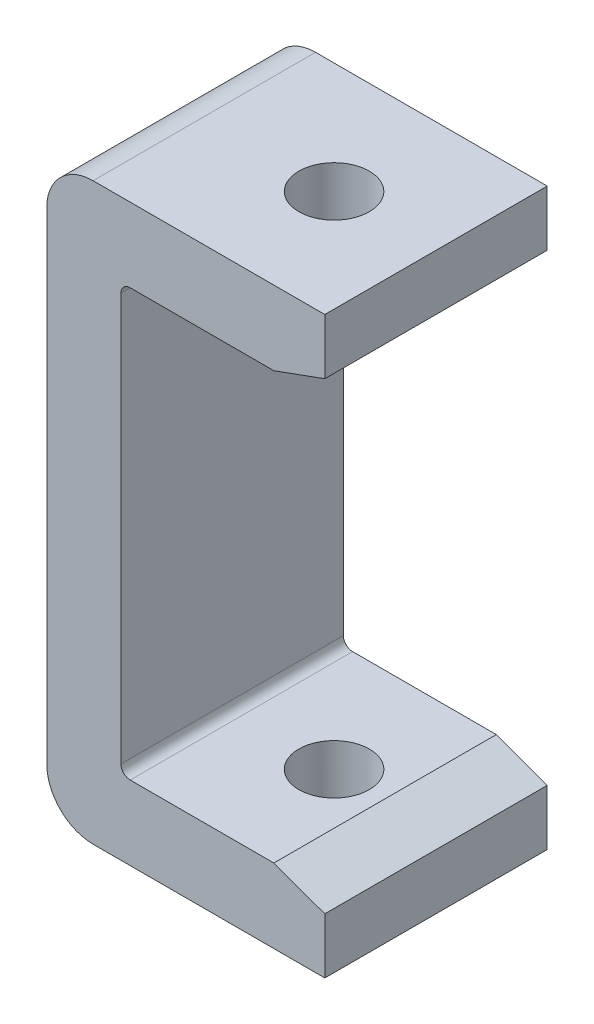
ISO-10303-21;
HEADER;
FILE_DESCRIPTION(('STEP AP214'),'2;1');
FILE_NAME('part.step','',(''),(''),'','','');
FILE_SCHEMA(('AUTOMOTIVE_DESIGN { 1 0 10303 214 1 1 1 1 }'));
ENDSEC;
DATA;
#1=APPLICATION_CONTEXT('core data for automotive mechanical design processes');
#2=APPLICATION_PROTOCOL_DEFINITION('international standard','automotive_design',2000,#1);
#3=PRODUCT_CONTEXT('',#1,'mechanical');
#4=PRODUCT('Part','Part','',(#3));
#5=PRODUCT_RELATED_PRODUCT_CATEGORY('part','',(#4));
#6=PRODUCT_DEFINITION_FORMATION('','',#4);
#7=PRODUCT_DEFINITION_CONTEXT('part definition',#1,'design');
#8=PRODUCT_DEFINITION('design','',#6,#7);
#9=PRODUCT_DEFINITION_SHAPE('','',#8);
#10=(LENGTH_UNIT() NAMED_UNIT(*) SI_UNIT(.MILLI.,.METRE.));
#11=(NAMED_UNIT(*) PLANE_ANGLE_UNIT() SI_UNIT($,.RADIAN.));
#12=(NAMED_UNIT(*) SI_UNIT($,.STERADIAN.) SOLID_ANGLE_UNIT());
#13=UNCERTAINTY_MEASURE_WITH_UNIT(LENGTH_MEASURE(1.E-05),#10,'distance_accuracy_value','');
#14=(GEOMETRIC_REPRESENTATION_CONTEXT(3) GLOBAL_UNCERTAINTY_ASSIGNED_CONTEXT((#13)) GLOBAL_UNIT_ASSIGNED_CONTEXT((#10,
#11,#12)) REPRESENTATION_CONTEXT('',''));
#15=CARTESIAN_POINT('',(0.,0.,0.));
#16=DIRECTION('',(0.,0.,1.));
#17=DIRECTION('',(1.,0.,0.));
#18=AXIS2_PLACEMENT_3D('',#15,#16,#17);
#19=CARTESIAN_POINT('',(-3.5,-11.5,12.));
#20=DIRECTION('',(0.,-1.,0.));
#21=DIRECTION('',(0.,0.,-1.));
#22=AXIS2_PLACEMENT_3D('',#19,#20,#21);
#23=PLANE('',#22);
#24=CARTESIAN_POINT('',(2.,-11.5,6.));
#25=DIRECTION('',(0.,-1.,0.));
#26=DIRECTION('',(0.,0.,-1.));
#27=AXIS2_PLACEMENT_3D('',#24,#25,#26);
#28=CIRCLE('',#27,1.9);
#29=CARTESIAN_POINT('',(2.,-11.5,4.1));
#30=VERTEX_POINT('',#29);
#31=EDGE_CURVE('E171',#30,#30,#28,.T.);
#32=ORIENTED_EDGE('',*,*,#31,.T.);
#33=EDGE_LOOP('',(#32));
#34=FACE_BOUND('',#33,.T.);
#35=DIRECTION('',(-1.,0.,0.));
#36=VECTOR('',#35,1.);
#37=CARTESIAN_POINT('',(3.5,-11.5,12.));
#38=LINE('',#37,#36);
#39=CARTESIAN_POINT('',(4.75252258054537,-11.5,12.));
#40=VERTEX_POINT('',#39);
#41=CARTESIAN_POINT('',(-3.,-11.5,12.));
#42=VERTEX_POINT('',#41);
#43=EDGE_CURVE('E187',#40,#42,#38,.T.);
#44=ORIENTED_EDGE('',*,*,#43,.F.);
#45=DIRECTION('',(0.,0.,-1.));
#46=VECTOR('',#45,1.);
#47=CARTESIAN_POINT('',(4.75252258054537,-11.5,12.));
#48=LINE('',#47,#46);
#49=CARTESIAN_POINT('',(4.75252258054537,-11.5,0.));
#50=VERTEX_POINT('',#49);
#51=EDGE_CURVE('E226',#40,#50,#48,.T.);
#52=ORIENTED_EDGE('',*,*,#51,.T.);
#53=DIRECTION('',(-1.,0.,0.));
#54=VECTOR('',#53,1.);
#55=CARTESIAN_POINT('',(-3.5,-11.5,0.));
#56=LINE('',#55,#54);
#57=CARTESIAN_POINT('',(-3.,-11.5,0.));
#58=VERTEX_POINT('',#57);
#59=EDGE_CURVE('E168',#50,#58,#56,.T.);
#60=ORIENTED_EDGE('',*,*,#59,.T.);
#61=DIRECTION('',(0.,0.,-1.));
#62=VECTOR('',#61,1.);
#63=CARTESIAN_POINT('',(-3.,-11.5,12.));
#64=LINE('',#63,#62);
#65=EDGE_CURVE('E197',#58,#42,#64,.F.);
#66=ORIENTED_EDGE('',*,*,#65,.T.);
#67=EDGE_LOOP('',(#44,#52,#60,#66));
#68=FACE_BOUND('',#67,.T.);
#69=ADVANCED_FACE('F33',(#34,#68),#23,.F.);
#70=CARTESIAN_POINT('',(-3.5,11.5,12.));
#71=DIRECTION('',(-1.,0.,0.));
#72=DIRECTION('',(0.,0.,1.));
#73=AXIS2_PLACEMENT_3D('',#70,#71,#72);
#74=PLANE('',#73);
#75=DIRECTION('',(0.,1.,0.));
#76=VECTOR('',#75,1.);
#77=CARTESIAN_POINT('',(-3.5,11.5,0.));
#78=LINE('',#77,#76);
#79=CARTESIAN_POINT('',(-3.5,-11.,0.));
#80=VERTEX_POINT('',#79);
#81=CARTESIAN_POINT('',(-3.5,11.,0.));
#82=VERTEX_POINT('',#81);
#83=EDGE_CURVE('E170',#80,#82,#78,.T.);
#84=ORIENTED_EDGE('',*,*,#83,.T.);
#85=DIRECTION('',(0.,0.,-1.));
#86=VECTOR('',#85,1.);
#87=CARTESIAN_POINT('',(-3.5,11.,12.));
#88=LINE('',#87,#86);
#89=CARTESIAN_POINT('',(-3.5,11.,12.));
#90=VERTEX_POINT('',#89);
#91=EDGE_CURVE('E195',#82,#90,#88,.F.);
#92=ORIENTED_EDGE('',*,*,#91,.T.);
#93=DIRECTION('',(0.,1.,0.));
#94=VECTOR('',#93,1.);
#95=CARTESIAN_POINT('',(-3.5,11.5,12.));
#96=LINE('',#95,#94);
#97=CARTESIAN_POINT('',(-3.5,-11.,12.));
#98=VERTEX_POINT('',#97);
#99=EDGE_CURVE('E278',#98,#90,#96,.T.);
#100=ORIENTED_EDGE('',*,*,#99,.F.);
#101=DIRECTION('',(0.,0.,-1.));
#102=VECTOR('',#101,1.);
#103=CARTESIAN_POINT('',(-3.5,-11.,0.));
#104=LINE('',#103,#102);
#105=EDGE_CURVE('E192',#98,#80,#104,.T.);
#106=ORIENTED_EDGE('',*,*,#105,.T.);
#107=EDGE_LOOP('',(#84,#92,#100,#106));
#108=FACE_BOUND('',#107,.T.);
#109=ADVANCED_FACE('F281',(#108),#74,.F.);
#110=CARTESIAN_POINT('',(3.5,11.5,12.));
#111=DIRECTION('',(0.,1.,0.));
#112=DIRECTION('',(0.,0.,1.));
#113=AXIS2_PLACEMENT_3D('',#110,#111,#112);
#114=PLANE('',#113);
#115=CARTESIAN_POINT('',(2.,11.5,6.));
#116=DIRECTION('',(0.,1.,0.));
#117=DIRECTION('',(0.,0.,1.));
#118=AXIS2_PLACEMENT_3D('',#115,#116,#117);
#119=CIRCLE('',#118,1.9);
#120=CARTESIAN_POINT('',(2.,11.5,7.9));
#121=VERTEX_POINT('',#120);
#122=EDGE_CURVE('E288',#121,#121,#119,.T.);
#123=ORIENTED_EDGE('',*,*,#122,.T.);
#124=EDGE_LOOP('',(#123));
#125=FACE_BOUND('',#124,.T.);
#126=DIRECTION('',(1.,0.,0.));
#127=VECTOR('',#126,1.);
#128=CARTESIAN_POINT('',(3.5,11.5,0.));
#129=LINE('',#128,#127);
#130=CARTESIAN_POINT('',(-3.,11.5,0.));
#131=VERTEX_POINT('',#130);
#132=CARTESIAN_POINT('',(4.75252258054537,11.5,0.));
#133=VERTEX_POINT('',#132);
#134=EDGE_CURVE('E174',#131,#133,#129,.T.);
#135=ORIENTED_EDGE('',*,*,#134,.T.);
#136=DIRECTION('',(0.,0.,1.));
#137=VECTOR('',#136,1.);
#138=CARTESIAN_POINT('',(4.75252258054537,11.5,12.));
#139=LINE('',#138,#137);
#140=CARTESIAN_POINT('',(4.75252258054537,11.5,12.));
#141=VERTEX_POINT('',#140);
#142=EDGE_CURVE('E11',#133,#141,#139,.T.);
#143=ORIENTED_EDGE('',*,*,#142,.T.);
#144=DIRECTION('',(1.,0.,0.));
#145=VECTOR('',#144,1.);
#146=CARTESIAN_POINT('',(-3.5,11.5,12.));
#147=LINE('',#146,#145);
#148=CARTESIAN_POINT('',(-3.,11.5,12.));
#149=VERTEX_POINT('',#148);
#150=EDGE_CURVE('E142',#149,#141,#147,.T.);
#151=ORIENTED_EDGE('',*,*,#150,.F.);
#152=DIRECTION('',(0.,0.,-1.));
#153=VECTOR('',#152,1.);
#154=CARTESIAN_POINT('',(-3.,11.5,0.));
#155=LINE('',#154,#153);
#156=EDGE_CURVE('E152',#149,#131,#155,.T.);
#157=ORIENTED_EDGE('',*,*,#156,.T.);
#158=EDGE_LOOP('',(#135,#143,#151,#157));
#159=FACE_BOUND('',#158,.T.);
#160=ADVANCED_FACE('F311',(#125,#159),#114,.F.);
#161=CARTESIAN_POINT('',(7.5,15.5,12.));
#162=DIRECTION('',(-1.,0.,0.));
#163=DIRECTION('',(0.,0.,1.));
#164=AXIS2_PLACEMENT_3D('',#161,#162,#163);
#165=PLANE('',#164);
#166=DIRECTION('',(0.,1.,0.));
#167=VECTOR('',#166,1.);
#168=CARTESIAN_POINT('',(7.5,15.5,12.));
#169=LINE('',#168,#167);
#170=CARTESIAN_POINT('',(7.5,12.5,12.));
#171=VERTEX_POINT('',#170);
#172=CARTESIAN_POINT('',(7.5,15.5,12.));
#173=VERTEX_POINT('',#172);
#174=EDGE_CURVE('E132',#171,#173,#169,.T.);
#175=ORIENTED_EDGE('',*,*,#174,.F.);
#176=DIRECTION('',(0.,0.,-1.));
#177=VECTOR('',#176,1.);
#178=CARTESIAN_POINT('',(7.5,12.5,12.));
#179=LINE('',#178,#177);
#180=CARTESIAN_POINT('',(7.5,12.5,0.));
#181=VERTEX_POINT('',#180);
#182=EDGE_CURVE('E41',#171,#181,#179,.T.);
#183=ORIENTED_EDGE('',*,*,#182,.T.);
#184=DIRECTION('',(0.,1.,0.));
#185=VECTOR('',#184,1.);
#186=CARTESIAN_POINT('',(7.5,15.5,0.));
#187=LINE('',#186,#185);
#188=CARTESIAN_POINT('',(7.5,15.5,0.));
#189=VERTEX_POINT('',#188);
#190=EDGE_CURVE('E148',#181,#189,#187,.T.);
#191=ORIENTED_EDGE('',*,*,#190,.T.);
#192=DIRECTION('',(0.,0.,-1.));
#193=VECTOR('',#192,1.);
#194=CARTESIAN_POINT('',(7.5,15.5,12.));
#195=LINE('',#194,#193);
#196=EDGE_CURVE('E145',#173,#189,#195,.T.);
#197=ORIENTED_EDGE('',*,*,#196,.F.);
#198=EDGE_LOOP('',(#175,#183,#191,#197));
#199=FACE_BOUND('',#198,.T.);
#200=ADVANCED_FACE('F146',(#199),#165,.F.);
#201=CARTESIAN_POINT('',(-7.5,15.5,12.));
#202=DIRECTION('',(0.,-1.,0.));
#203=DIRECTION('',(0.,0.,-1.));
#204=AXIS2_PLACEMENT_3D('',#201,#202,#203);
#205=PLANE('',#204);
#206=CARTESIAN_POINT('',(2.,15.5,6.));
#207=DIRECTION('',(0.,1.,0.));
#208=DIRECTION('',(0.,0.,1.));
#209=AXIS2_PLACEMENT_3D('',#206,#207,#208);
#210=CIRCLE('',#209,1.9);
#211=CARTESIAN_POINT('',(2.,15.5,7.9));
#212=VERTEX_POINT('',#211);
#213=EDGE_CURVE('E292',#212,#212,#210,.T.);
#214=ORIENTED_EDGE('',*,*,#213,.F.);
#215=EDGE_LOOP('',(#214));
#216=FACE_BOUND('',#215,.T.);
#217=DIRECTION('',(-1.,0.,0.));
#218=VECTOR('',#217,1.);
#219=CARTESIAN_POINT('',(-7.5,15.5,0.));
#220=LINE('',#219,#218);
#221=CARTESIAN_POINT('',(-5.,15.5,0.));
#222=VERTEX_POINT('',#221);
#223=EDGE_CURVE('E177',#189,#222,#220,.T.);
#224=ORIENTED_EDGE('',*,*,#223,.T.);
#225=DIRECTION('',(0.,0.,-1.));
#226=VECTOR('',#225,1.);
#227=CARTESIAN_POINT('',(-5.,15.5,12.));
#228=LINE('',#227,#226);
#229=CARTESIAN_POINT('',(-5.,15.5,12.));
#230=VERTEX_POINT('',#229);
#231=EDGE_CURVE('E157',#222,#230,#228,.F.);
#232=ORIENTED_EDGE('',*,*,#231,.T.);
#233=DIRECTION('',(-1.,0.,0.));
#234=VECTOR('',#233,1.);
#235=CARTESIAN_POINT('',(-7.5,15.5,12.));
#236=LINE('',#235,#234);
#237=EDGE_CURVE('E137',#173,#230,#236,.T.);
#238=ORIENTED_EDGE('',*,*,#237,.F.);
#239=ORIENTED_EDGE('',*,*,#196,.T.);
#240=EDGE_LOOP('',(#224,#232,#238,#239));
#241=FACE_BOUND('',#240,.T.);
#242=ADVANCED_FACE('F155',(#216,#241),#205,.F.);
#243=CARTESIAN_POINT('',(-7.5,15.5,12.));
#244=DIRECTION('',(1.,0.,0.));
#245=DIRECTION('',(0.,0.,-1.));
#246=AXIS2_PLACEMENT_3D('',#243,#244,#245);
#247=PLANE('',#246);
#248=DIRECTION('',(0.,-1.,0.));
#249=VECTOR('',#248,1.);
#250=CARTESIAN_POINT('',(-7.5,15.5,0.));
#251=LINE('',#250,#249);
#252=CARTESIAN_POINT('',(-7.5,13.,0.));
#253=VERTEX_POINT('',#252);
#254=CARTESIAN_POINT('',(-7.5,-13.,0.));
#255=VERTEX_POINT('',#254);
#256=EDGE_CURVE('E179',#253,#255,#251,.T.);
#257=ORIENTED_EDGE('',*,*,#256,.T.);
#258=DIRECTION('',(0.,0.,-1.));
#259=VECTOR('',#258,1.);
#260=CARTESIAN_POINT('',(-7.5,-13.,12.));
#261=LINE('',#260,#259);
#262=CARTESIAN_POINT('',(-7.5,-13.,12.));
#263=VERTEX_POINT('',#262);
#264=EDGE_CURVE('E219',#255,#263,#261,.F.);
#265=ORIENTED_EDGE('',*,*,#264,.T.);
#266=DIRECTION('',(0.,-1.,0.));
#267=VECTOR('',#266,1.);
#268=CARTESIAN_POINT('',(-7.5,15.5,12.));
#269=LINE('',#268,#267);
#270=CARTESIAN_POINT('',(-7.5,13.,12.));
#271=VERTEX_POINT('',#270);
#272=EDGE_CURVE('E158',#271,#263,#269,.T.);
#273=ORIENTED_EDGE('',*,*,#272,.F.);
#274=DIRECTION('',(0.,0.,-1.));
#275=VECTOR('',#274,1.);
#276=CARTESIAN_POINT('',(-7.5,13.,12.));
#277=LINE('',#276,#275);
#278=EDGE_CURVE('E216',#271,#253,#277,.T.);
#279=ORIENTED_EDGE('',*,*,#278,.T.);
#280=EDGE_LOOP('',(#257,#265,#273,#279));
#281=FACE_BOUND('',#280,.T.);
#282=ADVANCED_FACE('F249',(#281),#247,.F.);
#283=CARTESIAN_POINT('',(-7.5,-15.5,12.));
#284=DIRECTION('',(0.,1.,0.));
#285=DIRECTION('',(0.,0.,1.));
#286=AXIS2_PLACEMENT_3D('',#283,#284,#285);
#287=PLANE('',#286);
#288=CARTESIAN_POINT('',(2.,-15.5,6.));
#289=DIRECTION('',(0.,1.,0.));
#290=DIRECTION('',(0.,0.,1.));
#291=AXIS2_PLACEMENT_3D('',#288,#289,#290);
#292=CIRCLE('',#291,1.9);
#293=CARTESIAN_POINT('',(2.,-15.5,7.9));
#294=VERTEX_POINT('',#293);
#295=EDGE_CURVE('E291',#294,#294,#292,.T.);
#296=ORIENTED_EDGE('',*,*,#295,.T.);
#297=EDGE_LOOP('',(#296));
#298=FACE_BOUND('',#297,.T.);
#299=DIRECTION('',(1.,0.,0.));
#300=VECTOR('',#299,1.);
#301=CARTESIAN_POINT('',(-7.5,-15.5,12.));
#302=LINE('',#301,#300);
#303=CARTESIAN_POINT('',(-5.,-15.5,12.));
#304=VERTEX_POINT('',#303);
#305=CARTESIAN_POINT('',(7.5,-15.5,12.));
#306=VERTEX_POINT('',#305);
#307=EDGE_CURVE('E161',#304,#306,#302,.T.);
#308=ORIENTED_EDGE('',*,*,#307,.F.);
#309=DIRECTION('',(0.,0.,-1.));
#310=VECTOR('',#309,1.);
#311=CARTESIAN_POINT('',(-5.,-15.5,12.));
#312=LINE('',#311,#310);
#313=CARTESIAN_POINT('',(-5.,-15.5,0.));
#314=VERTEX_POINT('',#313);
#315=EDGE_CURVE('E209',#304,#314,#312,.T.);
#316=ORIENTED_EDGE('',*,*,#315,.T.);
#317=DIRECTION('',(1.,0.,0.));
#318=VECTOR('',#317,1.);
#319=CARTESIAN_POINT('',(-7.5,-15.5,0.));
#320=LINE('',#319,#318);
#321=CARTESIAN_POINT('',(7.5,-15.5,0.));
#322=VERTEX_POINT('',#321);
#323=EDGE_CURVE('E182',#314,#322,#320,.T.);
#324=ORIENTED_EDGE('',*,*,#323,.T.);
#325=DIRECTION('',(0.,0.,-1.));
#326=VECTOR('',#325,1.);
#327=CARTESIAN_POINT('',(7.5,-15.5,12.));
#328=LINE('',#327,#326);
#329=EDGE_CURVE('E153',#306,#322,#328,.T.);
#330=ORIENTED_EDGE('',*,*,#329,.F.);
#331=EDGE_LOOP('',(#308,#316,#324,#330));
#332=FACE_BOUND('',#331,.T.);
#333=ADVANCED_FACE('F257',(#298,#332),#287,.F.);
#334=CARTESIAN_POINT('',(7.5,-11.5,12.));
#335=DIRECTION('',(-1.,0.,0.));
#336=DIRECTION('',(0.,0.,1.));
#337=AXIS2_PLACEMENT_3D('',#334,#335,#336);
#338=PLANE('',#337);
#339=DIRECTION('',(0.,1.,0.));
#340=VECTOR('',#339,1.);
#341=CARTESIAN_POINT('',(7.5,-11.5,0.));
#342=LINE('',#341,#340);
#343=CARTESIAN_POINT('',(7.5,-12.5,0.));
#344=VERTEX_POINT('',#343);
#345=EDGE_CURVE('E184',#322,#344,#342,.T.);
#346=ORIENTED_EDGE('',*,*,#345,.T.);
#347=DIRECTION('',(0.,0.,1.));
#348=VECTOR('',#347,1.);
#349=CARTESIAN_POINT('',(7.5,-12.5,12.));
#350=LINE('',#349,#348);
#351=CARTESIAN_POINT('',(7.5,-12.5,12.));
#352=VERTEX_POINT('',#351);
#353=EDGE_CURVE('E233',#344,#352,#350,.T.);
#354=ORIENTED_EDGE('',*,*,#353,.T.);
#355=DIRECTION('',(0.,1.,0.));
#356=VECTOR('',#355,1.);
#357=CARTESIAN_POINT('',(7.5,-11.5,12.));
#358=LINE('',#357,#356);
#359=EDGE_CURVE('E166',#306,#352,#358,.T.);
#360=ORIENTED_EDGE('',*,*,#359,.F.);
#361=ORIENTED_EDGE('',*,*,#329,.T.);
#362=EDGE_LOOP('',(#346,#354,#360,#361));
#363=FACE_BOUND('',#362,.T.);
#364=ADVANCED_FACE('F262',(#363),#338,.F.);
#365=CARTESIAN_POINT('',(0.,0.,12.));
#366=DIRECTION('',(0.,0.,-1.));
#367=DIRECTION('',(-1.,0.,0.));
#368=AXIS2_PLACEMENT_3D('',#365,#366,#367);
#369=PLANE('',#368);
#370=ORIENTED_EDGE('',*,*,#359,.T.);
#371=DIRECTION('',(0.939692620785908,-0.34202014332567,0.));
#372=VECTOR('',#371,1.);
#373=CARTESIAN_POINT('',(4.75252258054537,-11.5,12.));
#374=LINE('',#373,#372);
#375=EDGE_CURVE('E236',#352,#40,#374,.F.);
#376=ORIENTED_EDGE('',*,*,#375,.T.);
#377=ORIENTED_EDGE('',*,*,#43,.T.);
#378=CARTESIAN_POINT('',(-3.,-11.,12.));
#379=DIRECTION('',(0.,0.,-1.));
#380=DIRECTION('',(-1.,0.,0.));
#381=AXIS2_PLACEMENT_3D('',#378,#379,#380);
#382=CIRCLE('',#381,0.5);
#383=EDGE_CURVE('E207',#42,#98,#382,.T.);
#384=ORIENTED_EDGE('',*,*,#383,.T.);
#385=ORIENTED_EDGE('',*,*,#99,.T.);
#386=CARTESIAN_POINT('',(-3.,11.,12.));
#387=DIRECTION('',(0.,0.,-1.));
#388=DIRECTION('',(-1.,0.,0.));
#389=AXIS2_PLACEMENT_3D('',#386,#387,#388);
#390=CIRCLE('',#389,0.5);
#391=EDGE_CURVE('E202',#90,#149,#390,.T.);
#392=ORIENTED_EDGE('',*,*,#391,.T.);
#393=ORIENTED_EDGE('',*,*,#150,.T.);
#394=DIRECTION('',(-0.939692620785908,-0.34202014332567,0.));
#395=VECTOR('',#394,1.);
#396=CARTESIAN_POINT('',(7.5,12.5,12.));
#397=LINE('',#396,#395);
#398=EDGE_CURVE('E48',#141,#171,#397,.F.);
#399=ORIENTED_EDGE('',*,*,#398,.T.);
#400=ORIENTED_EDGE('',*,*,#174,.T.);
#401=ORIENTED_EDGE('',*,*,#237,.T.);
#402=CARTESIAN_POINT('',(-5.,13.,12.));
#403=DIRECTION('',(0.,0.,-1.));
#404=DIRECTION('',(-1.,0.,0.));
#405=AXIS2_PLACEMENT_3D('',#402,#403,#404);
#406=CIRCLE('',#405,2.5);
#407=EDGE_CURVE('E221',#230,#271,#406,.F.);
#408=ORIENTED_EDGE('',*,*,#407,.T.);
#409=ORIENTED_EDGE('',*,*,#272,.T.);
#410=CARTESIAN_POINT('',(-5.,-13.,12.));
#411=DIRECTION('',(0.,0.,-1.));
#412=DIRECTION('',(-1.,0.,0.));
#413=AXIS2_PLACEMENT_3D('',#410,#411,#412);
#414=CIRCLE('',#413,2.5);
#415=EDGE_CURVE('E223',#263,#304,#414,.F.);
#416=ORIENTED_EDGE('',*,*,#415,.T.);
#417=ORIENTED_EDGE('',*,*,#307,.T.);
#418=EDGE_LOOP('',(#370,#376,#377,#384,#385,#392,#393,#399,#400,#401,#408,#409,#416,#417));
#419=FACE_BOUND('',#418,.T.);
#420=ADVANCED_FACE('F135',(#419),#369,.F.);
#421=CARTESIAN_POINT('',(0.,0.,0.));
#422=DIRECTION('',(0.,0.,-1.));
#423=DIRECTION('',(-1.,0.,0.));
#424=AXIS2_PLACEMENT_3D('',#421,#422,#423);
#425=PLANE('',#424);
#426=ORIENTED_EDGE('',*,*,#59,.F.);
#427=DIRECTION('',(-0.939692620785908,0.34202014332567,0.));
#428=VECTOR('',#427,1.);
#429=CARTESIAN_POINT('',(-3.14008922223705,-8.62732423316908,0.));
#430=LINE('',#429,#428);
#431=EDGE_CURVE('E231',#50,#344,#430,.F.);
#432=ORIENTED_EDGE('',*,*,#431,.T.);
#433=ORIENTED_EDGE('',*,*,#345,.F.);
#434=ORIENTED_EDGE('',*,*,#323,.F.);
#435=CARTESIAN_POINT('',(-5.,-13.,0.));
#436=DIRECTION('',(0.,0.,-1.));
#437=DIRECTION('',(-1.,0.,0.));
#438=AXIS2_PLACEMENT_3D('',#435,#436,#437);
#439=CIRCLE('',#438,2.5);
#440=EDGE_CURVE('E214',#314,#255,#439,.T.);
#441=ORIENTED_EDGE('',*,*,#440,.T.);
#442=ORIENTED_EDGE('',*,*,#256,.F.);
#443=CARTESIAN_POINT('',(-5.,13.,0.));
#444=DIRECTION('',(0.,0.,-1.));
#445=DIRECTION('',(-1.,0.,0.));
#446=AXIS2_PLACEMENT_3D('',#443,#444,#445);
#447=CIRCLE('',#446,2.5);
#448=EDGE_CURVE('E212',#253,#222,#447,.T.);
#449=ORIENTED_EDGE('',*,*,#448,.T.);
#450=ORIENTED_EDGE('',*,*,#223,.F.);
#451=ORIENTED_EDGE('',*,*,#190,.F.);
#452=DIRECTION('',(0.939692620785908,0.34202014332567,0.));
#453=VECTOR('',#452,1.);
#454=CARTESIAN_POINT('',(-3.14008922223705,8.62732423316908,0.));
#455=LINE('',#454,#453);
#456=EDGE_CURVE('E229',#181,#133,#455,.F.);
#457=ORIENTED_EDGE('',*,*,#456,.T.);
#458=ORIENTED_EDGE('',*,*,#134,.F.);
#459=CARTESIAN_POINT('',(-3.,11.,0.));
#460=DIRECTION('',(0.,0.,-1.));
#461=DIRECTION('',(-1.,0.,0.));
#462=AXIS2_PLACEMENT_3D('',#459,#460,#461);
#463=CIRCLE('',#462,0.5);
#464=EDGE_CURVE('E200',#131,#82,#463,.F.);
#465=ORIENTED_EDGE('',*,*,#464,.T.);
#466=ORIENTED_EDGE('',*,*,#83,.F.);
#467=CARTESIAN_POINT('',(-3.,-11.,0.));
#468=DIRECTION('',(0.,0.,-1.));
#469=DIRECTION('',(-1.,0.,0.));
#470=AXIS2_PLACEMENT_3D('',#467,#468,#469);
#471=CIRCLE('',#470,0.5);
#472=EDGE_CURVE('E204',#80,#58,#471,.F.);
#473=ORIENTED_EDGE('',*,*,#472,.T.);
#474=EDGE_LOOP('',(#426,#432,#433,#434,#441,#442,#449,#450,#451,#457,#458,#465,#466,#473));
#475=FACE_BOUND('',#474,.T.);
#476=ADVANCED_FACE('F240',(#475),#425,.T.);
#477=CARTESIAN_POINT('',(2.,-15.5,6.));
#478=DIRECTION('',(0.,1.,0.));
#479=DIRECTION('',(0.,0.,1.));
#480=AXIS2_PLACEMENT_3D('',#477,#478,#479);
#481=CYLINDRICAL_SURFACE('',#480,1.9);
#482=ORIENTED_EDGE('',*,*,#295,.F.);
#483=EDGE_LOOP('',(#482));
#484=FACE_BOUND('',#483,.T.);
#485=ORIENTED_EDGE('',*,*,#31,.F.);
#486=EDGE_LOOP('',(#485));
#487=FACE_BOUND('',#486,.T.);
#488=ADVANCED_FACE('F299',(#484,#487),#481,.F.);
#489=ORIENTED_EDGE('',*,*,#213,.T.);
#490=EDGE_LOOP('',(#489));
#491=FACE_BOUND('',#490,.T.);
#492=ORIENTED_EDGE('',*,*,#122,.F.);
#493=EDGE_LOOP('',(#492));
#494=FACE_BOUND('',#493,.T.);
#495=ADVANCED_FACE('F302',(#491,#494),#481,.F.);
#496=CARTESIAN_POINT('',(-3.,11.,12.));
#497=DIRECTION('',(0.,0.,1.));
#498=DIRECTION('',(1.,0.,0.));
#499=AXIS2_PLACEMENT_3D('',#496,#497,#498);
#500=CYLINDRICAL_SURFACE('',#499,0.5);
#501=ORIENTED_EDGE('',*,*,#391,.F.);
#502=ORIENTED_EDGE('',*,*,#91,.F.);
#503=ORIENTED_EDGE('',*,*,#464,.F.);
#504=ORIENTED_EDGE('',*,*,#156,.F.);
#505=EDGE_LOOP('',(#501,#502,#503,#504));
#506=FACE_BOUND('',#505,.T.);
#507=ADVANCED_FACE('F315',(#506),#500,.F.);
#508=CARTESIAN_POINT('',(-3.,-11.,12.));
#509=DIRECTION('',(0.,0.,1.));
#510=DIRECTION('',(1.,0.,0.));
#511=AXIS2_PLACEMENT_3D('',#508,#509,#510);
#512=CYLINDRICAL_SURFACE('',#511,0.5);
#513=ORIENTED_EDGE('',*,*,#383,.F.);
#514=ORIENTED_EDGE('',*,*,#65,.F.);
#515=ORIENTED_EDGE('',*,*,#472,.F.);
#516=ORIENTED_EDGE('',*,*,#105,.F.);
#517=EDGE_LOOP('',(#513,#514,#515,#516));
#518=FACE_BOUND('',#517,.T.);
#519=ADVANCED_FACE('F275',(#518),#512,.F.);
#520=CARTESIAN_POINT('',(-5.,-13.,12.));
#521=DIRECTION('',(0.,0.,-1.));
#522=DIRECTION('',(-1.,0.,0.));
#523=AXIS2_PLACEMENT_3D('',#520,#521,#522);
#524=CYLINDRICAL_SURFACE('',#523,2.5);
#525=ORIENTED_EDGE('',*,*,#415,.F.);
#526=ORIENTED_EDGE('',*,*,#264,.F.);
#527=ORIENTED_EDGE('',*,*,#440,.F.);
#528=ORIENTED_EDGE('',*,*,#315,.F.);
#529=EDGE_LOOP('',(#525,#526,#527,#528));
#530=FACE_BOUND('',#529,.T.);
#531=ADVANCED_FACE('F252',(#530),#524,.T.);
#532=CARTESIAN_POINT('',(-5.,13.,12.));
#533=DIRECTION('',(0.,0.,-1.));
#534=DIRECTION('',(-1.,0.,0.));
#535=AXIS2_PLACEMENT_3D('',#532,#533,#534);
#536=CYLINDRICAL_SURFACE('',#535,2.5);
#537=ORIENTED_EDGE('',*,*,#407,.F.);
#538=ORIENTED_EDGE('',*,*,#231,.F.);
#539=ORIENTED_EDGE('',*,*,#448,.F.);
#540=ORIENTED_EDGE('',*,*,#278,.F.);
#541=EDGE_LOOP('',(#537,#538,#539,#540));
#542=FACE_BOUND('',#541,.T.);
#543=ADVANCED_FACE('F244',(#542),#536,.T.);
#544=CARTESIAN_POINT('',(4.75252258054537,-11.5,12.));
#545=DIRECTION('',(-0.34202014332567,-0.939692620785908,0.));
#546=DIRECTION('',(0.,0.,-1.));
#547=AXIS2_PLACEMENT_3D('',#544,#545,#546);
#548=PLANE('',#547);
#549=ORIENTED_EDGE('',*,*,#375,.F.);
#550=ORIENTED_EDGE('',*,*,#353,.F.);
#551=ORIENTED_EDGE('',*,*,#431,.F.);
#552=ORIENTED_EDGE('',*,*,#51,.F.);
#553=EDGE_LOOP('',(#549,#550,#551,#552));
#554=FACE_BOUND('',#553,.T.);
#555=ADVANCED_FACE('F268',(#554),#548,.F.);
#556=CARTESIAN_POINT('',(7.5,12.5,12.));
#557=DIRECTION('',(-0.34202014332567,0.939692620785908,0.));
#558=DIRECTION('',(0.,0.,-1.));
#559=AXIS2_PLACEMENT_3D('',#556,#557,#558);
#560=PLANE('',#559);
#561=ORIENTED_EDGE('',*,*,#398,.F.);
#562=ORIENTED_EDGE('',*,*,#142,.F.);
#563=ORIENTED_EDGE('',*,*,#456,.F.);
#564=ORIENTED_EDGE('',*,*,#182,.F.);
#565=EDGE_LOOP('',(#561,#562,#563,#564));
#566=FACE_BOUND('',#565,.T.);
#567=ADVANCED_FACE('F35',(#566),#560,.F.);
#568=CLOSED_SHELL('',(#69,#109,#160,#200,#242,#282,#333,#364,#420,#476,#488,#495,#507,#519,#531,
#543,#555,#567));
#569=MANIFOLD_SOLID_BREP('B2',#568);
#570=ADVANCED_BREP_SHAPE_REPRESENTATION('',(#18,#569),#14);
#571=SHAPE_DEFINITION_REPRESENTATION(#9,#570);
ENDSEC;
END-ISO-10303-21;
